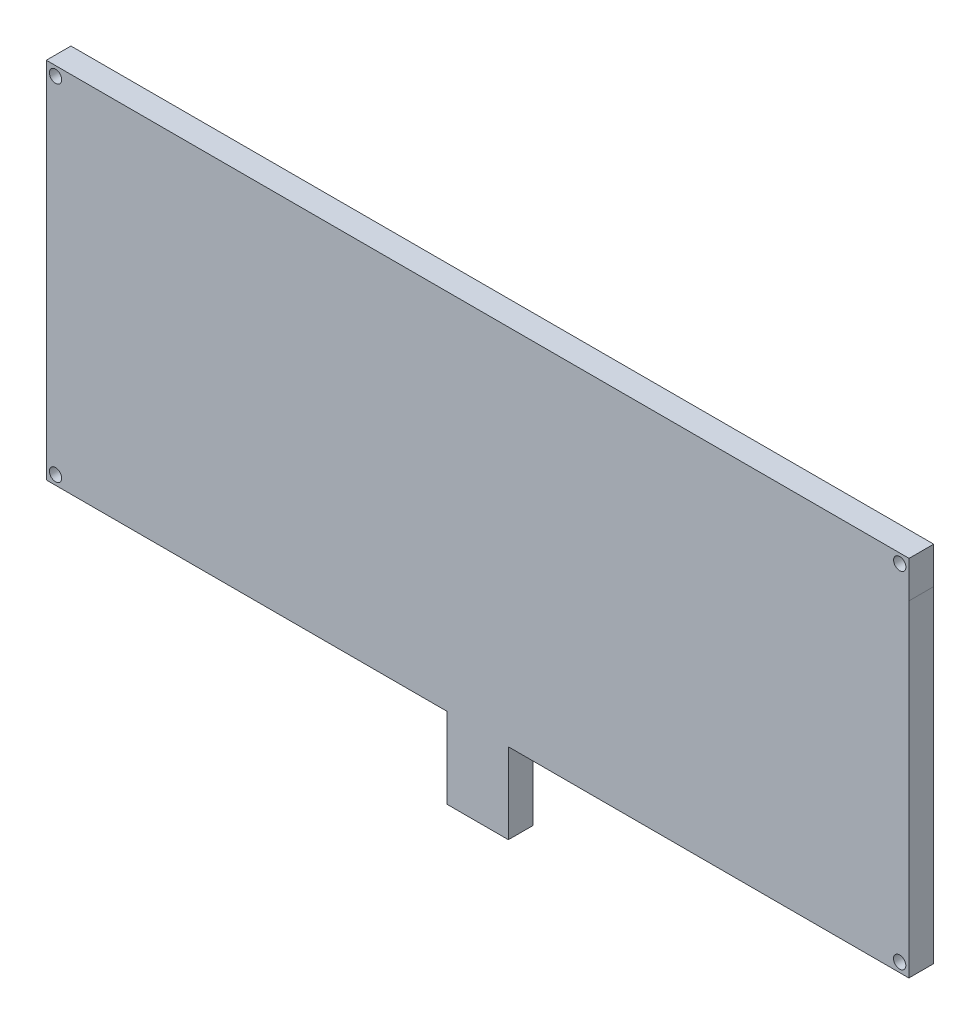
ISO-10303-21;
HEADER;
FILE_DESCRIPTION(('STEP AP214'),'2;1');
FILE_NAME('part.step','',(''),(''),'','','');
FILE_SCHEMA(('AUTOMOTIVE_DESIGN { 1 0 10303 214 1 1 1 1 }'));
ENDSEC;
DATA;
#1=APPLICATION_CONTEXT('core data for automotive mechanical design processes');
#2=APPLICATION_PROTOCOL_DEFINITION('international standard','automotive_design',2000,#1);
#3=PRODUCT_CONTEXT('',#1,'mechanical');
#4=PRODUCT('Part','Part','',(#3));
#5=PRODUCT_RELATED_PRODUCT_CATEGORY('part','',(#4));
#6=PRODUCT_DEFINITION_FORMATION('','',#4);
#7=PRODUCT_DEFINITION_CONTEXT('part definition',#1,'design');
#8=PRODUCT_DEFINITION('design','',#6,#7);
#9=PRODUCT_DEFINITION_SHAPE('','',#8);
#10=(LENGTH_UNIT() NAMED_UNIT(*) SI_UNIT(.MILLI.,.METRE.));
#11=(NAMED_UNIT(*) PLANE_ANGLE_UNIT() SI_UNIT($,.RADIAN.));
#12=(NAMED_UNIT(*) SI_UNIT($,.STERADIAN.) SOLID_ANGLE_UNIT());
#13=UNCERTAINTY_MEASURE_WITH_UNIT(LENGTH_MEASURE(1.E-05),#10,'distance_accuracy_value','');
#14=(GEOMETRIC_REPRESENTATION_CONTEXT(3) GLOBAL_UNCERTAINTY_ASSIGNED_CONTEXT((#13)) GLOBAL_UNIT_ASSIGNED_CONTEXT((#10,
#11,#12)) REPRESENTATION_CONTEXT('',''));
#15=CARTESIAN_POINT('',(0.,0.,0.));
#16=DIRECTION('',(0.,0.,1.));
#17=DIRECTION('',(1.,0.,0.));
#18=AXIS2_PLACEMENT_3D('',#15,#16,#17);
#19=CARTESIAN_POINT('',(-4.99956384997567,-26.5660402151457,4.));
#20=DIRECTION('',(1.,0.,0.));
#21=DIRECTION('',(0.,1.,0.));
#22=AXIS2_PLACEMENT_3D('',#19,#20,#21);
#23=PLANE('',#22);
#24=DIRECTION('',(0.,-1.,0.));
#25=VECTOR('',#24,1.);
#26=CARTESIAN_POINT('',(-4.99956384997567,-26.5660402151457,0.));
#27=LINE('',#26,#25);
#28=CARTESIAN_POINT('',(-4.99956384997567,-26.5,0.));
#29=VERTEX_POINT('',#28);
#30=CARTESIAN_POINT('',(-4.99956384997566,-39.5660402151457,0.));
#31=VERTEX_POINT('',#30);
#32=EDGE_CURVE('E93',#29,#31,#27,.T.);
#33=ORIENTED_EDGE('',*,*,#32,.T.);
#34=DIRECTION('',(0.,0.,-1.));
#35=VECTOR('',#34,1.);
#36=CARTESIAN_POINT('',(-4.99956384997566,-39.5660402151457,4.));
#37=LINE('',#36,#35);
#38=CARTESIAN_POINT('',(-4.99956384997566,-39.5660402151457,4.));
#39=VERTEX_POINT('',#38);
#40=EDGE_CURVE('E71',#39,#31,#37,.T.);
#41=ORIENTED_EDGE('',*,*,#40,.F.);
#42=DIRECTION('',(0.,-1.,0.));
#43=VECTOR('',#42,1.);
#44=CARTESIAN_POINT('',(-4.99956384997567,-26.5660402151457,4.));
#45=LINE('',#44,#43);
#46=CARTESIAN_POINT('',(-4.99956384997567,-26.5,4.));
#47=VERTEX_POINT('',#46);
#48=EDGE_CURVE('E105',#47,#39,#45,.T.);
#49=ORIENTED_EDGE('',*,*,#48,.F.);
#50=DIRECTION('',(0.,0.,-1.));
#51=VECTOR('',#50,1.);
#52=CARTESIAN_POINT('',(-4.99956384997567,-26.5,4.));
#53=LINE('',#52,#51);
#54=EDGE_CURVE('E12',#47,#29,#53,.T.);
#55=ORIENTED_EDGE('',*,*,#54,.T.);
#56=EDGE_LOOP('',(#33,#41,#49,#55));
#57=FACE_BOUND('',#56,.T.);
#58=ADVANCED_FACE('F61',(#57),#23,.F.);
#59=CARTESIAN_POINT('',(5.,-39.5660402151457,4.));
#60=DIRECTION('',(0.,1.,0.));
#61=DIRECTION('',(0.,0.,1.));
#62=AXIS2_PLACEMENT_3D('',#59,#60,#61);
#63=PLANE('',#62);
#64=DIRECTION('',(1.,0.,0.));
#65=VECTOR('',#64,1.);
#66=CARTESIAN_POINT('',(5.,-39.5660402151457,0.));
#67=LINE('',#66,#65);
#68=CARTESIAN_POINT('',(5.,-39.5660402151457,0.));
#69=VERTEX_POINT('',#68);
#70=EDGE_CURVE('E100',#31,#69,#67,.T.);
#71=ORIENTED_EDGE('',*,*,#70,.T.);
#72=DIRECTION('',(0.,0.,-1.));
#73=VECTOR('',#72,1.);
#74=CARTESIAN_POINT('',(5.,-39.5660402151457,4.));
#75=LINE('',#74,#73);
#76=CARTESIAN_POINT('',(5.,-39.5660402151457,4.));
#77=VERTEX_POINT('',#76);
#78=EDGE_CURVE('E228',#77,#69,#75,.T.);
#79=ORIENTED_EDGE('',*,*,#78,.F.);
#80=DIRECTION('',(1.,0.,0.));
#81=VECTOR('',#80,1.);
#82=CARTESIAN_POINT('',(5.,-39.5660402151457,4.));
#83=LINE('',#82,#81);
#84=EDGE_CURVE('E212',#39,#77,#83,.T.);
#85=ORIENTED_EDGE('',*,*,#84,.F.);
#86=ORIENTED_EDGE('',*,*,#40,.T.);
#87=EDGE_LOOP('',(#71,#79,#85,#86));
#88=FACE_BOUND('',#87,.T.);
#89=ADVANCED_FACE('F283',(#88),#63,.F.);
#90=CARTESIAN_POINT('',(5.,-26.5,4.));
#91=DIRECTION('',(-1.,0.,0.));
#92=DIRECTION('',(0.,-1.,0.));
#93=AXIS2_PLACEMENT_3D('',#90,#91,#92);
#94=PLANE('',#93);
#95=DIRECTION('',(0.,1.,0.));
#96=VECTOR('',#95,1.);
#97=CARTESIAN_POINT('',(5.,-26.5,0.));
#98=LINE('',#97,#96);
#99=CARTESIAN_POINT('',(5.,-26.5,0.));
#100=VERTEX_POINT('',#99);
#101=EDGE_CURVE('E213',#69,#100,#98,.T.);
#102=ORIENTED_EDGE('',*,*,#101,.T.);
#103=DIRECTION('',(0.,0.,-1.));
#104=VECTOR('',#103,1.);
#105=CARTESIAN_POINT('',(5.,-26.5,4.));
#106=LINE('',#105,#104);
#107=CARTESIAN_POINT('',(5.,-26.5,4.));
#108=VERTEX_POINT('',#107);
#109=EDGE_CURVE('E218',#108,#100,#106,.T.);
#110=ORIENTED_EDGE('',*,*,#109,.F.);
#111=DIRECTION('',(0.,1.,0.));
#112=VECTOR('',#111,1.);
#113=CARTESIAN_POINT('',(5.,-26.5,4.));
#114=LINE('',#113,#112);
#115=EDGE_CURVE('E80',#77,#108,#114,.T.);
#116=ORIENTED_EDGE('',*,*,#115,.F.);
#117=ORIENTED_EDGE('',*,*,#78,.T.);
#118=EDGE_LOOP('',(#102,#110,#116,#117));
#119=FACE_BOUND('',#118,.T.);
#120=ADVANCED_FACE('F281',(#119),#94,.F.);
#121=CARTESIAN_POINT('',(0.,0.,4.));
#122=DIRECTION('',(0.,0.,-1.));
#123=DIRECTION('',(-1.,0.,0.));
#124=AXIS2_PLACEMENT_3D('',#121,#122,#123);
#125=PLANE('',#124);
#126=CARTESIAN_POINT('',(-68.4961847591732,-25.,4.));
#127=DIRECTION('',(0.,0.,1.));
#128=DIRECTION('',(1.,0.,0.));
#129=AXIS2_PLACEMENT_3D('',#126,#127,#128);
#130=CIRCLE('',#129,0.999999999999998);
#131=CARTESIAN_POINT('',(-67.4961847591732,-25.,4.));
#132=VERTEX_POINT('',#131);
#133=EDGE_CURVE('E241',#132,#132,#130,.T.);
#134=ORIENTED_EDGE('',*,*,#133,.F.);
#135=EDGE_LOOP('',(#134));
#136=FACE_BOUND('',#135,.T.);
#137=CARTESIAN_POINT('',(68.5038152408268,-25.,4.));
#138=DIRECTION('',(0.,0.,1.));
#139=DIRECTION('',(1.,0.,0.));
#140=AXIS2_PLACEMENT_3D('',#137,#138,#139);
#141=CIRCLE('',#140,0.999999999999998);
#142=CARTESIAN_POINT('',(69.5038152408268,-25.,4.));
#143=VERTEX_POINT('',#142);
#144=EDGE_CURVE('E456',#143,#143,#141,.T.);
#145=ORIENTED_EDGE('',*,*,#144,.F.);
#146=EDGE_LOOP('',(#145));
#147=FACE_BOUND('',#146,.T.);
#148=CARTESIAN_POINT('',(68.5188581291216,31.,4.));
#149=DIRECTION('',(0.,0.,1.));
#150=DIRECTION('',(1.,0.,0.));
#151=AXIS2_PLACEMENT_3D('',#148,#149,#150);
#152=CIRCLE('',#151,0.999999999999997);
#153=CARTESIAN_POINT('',(69.5188581291216,31.,4.));
#154=VERTEX_POINT('',#153);
#155=EDGE_CURVE('E459',#154,#154,#152,.T.);
#156=ORIENTED_EDGE('',*,*,#155,.F.);
#157=EDGE_LOOP('',(#156));
#158=FACE_BOUND('',#157,.T.);
#159=CARTESIAN_POINT('',(-68.4961847591732,31.,4.));
#160=DIRECTION('',(0.,0.,-1.));
#161=DIRECTION('',(-1.,0.,0.));
#162=AXIS2_PLACEMENT_3D('',#159,#160,#161);
#163=CIRCLE('',#162,0.999999999999997);
#164=CARTESIAN_POINT('',(-69.4961847591732,31.,4.));
#165=VERTEX_POINT('',#164);
#166=EDGE_CURVE('E176',#165,#165,#163,.T.);
#167=ORIENTED_EDGE('',*,*,#166,.T.);
#168=EDGE_LOOP('',(#167));
#169=FACE_BOUND('',#168,.T.);
#170=ORIENTED_EDGE('',*,*,#115,.T.);
#171=DIRECTION('',(1.,0.,0.));
#172=VECTOR('',#171,1.);
#173=CARTESIAN_POINT('',(-70.,-26.5,4.));
#174=LINE('',#173,#172);
#175=CARTESIAN_POINT('',(70.,-26.5,4.));
#176=VERTEX_POINT('',#175);
#177=EDGE_CURVE('E185',#108,#176,#174,.T.);
#178=ORIENTED_EDGE('',*,*,#177,.T.);
#179=DIRECTION('',(0.,1.,0.));
#180=VECTOR('',#179,1.);
#181=CARTESIAN_POINT('',(70.,-26.5,4.));
#182=LINE('',#181,#180);
#183=CARTESIAN_POINT('',(70.,26.5,4.));
#184=VERTEX_POINT('',#183);
#185=EDGE_CURVE('E147',#176,#184,#182,.T.);
#186=ORIENTED_EDGE('',*,*,#185,.T.);
#187=DIRECTION('',(0.00501423306183546,0.999987428654381,0.));
#188=VECTOR('',#187,1.);
#189=CARTESIAN_POINT('',(70.0300857765897,32.5,4.));
#190=LINE('',#189,#188);
#191=CARTESIAN_POINT('',(70.0300857765897,32.5,4.));
#192=VERTEX_POINT('',#191);
#193=EDGE_CURVE('E140',#184,#192,#190,.T.);
#194=ORIENTED_EDGE('',*,*,#193,.T.);
#195=DIRECTION('',(-1.,0.,0.));
#196=VECTOR('',#195,1.);
#197=CARTESIAN_POINT('',(-70.,32.5,4.));
#198=LINE('',#197,#196);
#199=CARTESIAN_POINT('',(-70.,32.5,4.));
#200=VERTEX_POINT('',#199);
#201=EDGE_CURVE('E144',#192,#200,#198,.T.);
#202=ORIENTED_EDGE('',*,*,#201,.T.);
#203=DIRECTION('',(0.,-1.,0.));
#204=VECTOR('',#203,1.);
#205=CARTESIAN_POINT('',(-70.,-26.5,4.));
#206=LINE('',#205,#204);
#207=CARTESIAN_POINT('',(-70.,-26.5,4.));
#208=VERTEX_POINT('',#207);
#209=EDGE_CURVE('E181',#200,#208,#206,.T.);
#210=ORIENTED_EDGE('',*,*,#209,.T.);
#211=EDGE_CURVE('E186',#208,#47,#174,.T.);
#212=ORIENTED_EDGE('',*,*,#211,.T.);
#213=ORIENTED_EDGE('',*,*,#48,.T.);
#214=ORIENTED_EDGE('',*,*,#84,.T.);
#215=EDGE_LOOP('',(#170,#178,#186,#194,#202,#210,#212,#213,#214));
#216=FACE_BOUND('',#215,.T.);
#217=ADVANCED_FACE('F142',(#136,#147,#158,#169,#216),#125,.F.);
#218=CARTESIAN_POINT('',(0.,0.,0.));
#219=DIRECTION('',(0.,0.,-1.));
#220=DIRECTION('',(-1.,0.,0.));
#221=AXIS2_PLACEMENT_3D('',#218,#219,#220);
#222=PLANE('',#221);
#223=CARTESIAN_POINT('',(-68.4961847591732,-25.,0.));
#224=DIRECTION('',(0.,0.,-1.));
#225=DIRECTION('',(-1.,0.,0.));
#226=AXIS2_PLACEMENT_3D('',#223,#224,#225);
#227=CIRCLE('',#226,0.999999999999998);
#228=CARTESIAN_POINT('',(-67.4961847591732,-25.,0.));
#229=VERTEX_POINT('',#228);
#230=EDGE_CURVE('E64',#229,#229,#227,.T.);
#231=ORIENTED_EDGE('',*,*,#230,.F.);
#232=EDGE_LOOP('',(#231));
#233=FACE_BOUND('',#232,.T.);
#234=CARTESIAN_POINT('',(68.5038152408268,-25.,0.));
#235=DIRECTION('',(0.,0.,-1.));
#236=DIRECTION('',(-1.,0.,0.));
#237=AXIS2_PLACEMENT_3D('',#234,#235,#236);
#238=CIRCLE('',#237,0.999999999999998);
#239=CARTESIAN_POINT('',(69.5038152408268,-25.,0.));
#240=VERTEX_POINT('',#239);
#241=EDGE_CURVE('E240',#240,#240,#238,.T.);
#242=ORIENTED_EDGE('',*,*,#241,.F.);
#243=EDGE_LOOP('',(#242));
#244=FACE_BOUND('',#243,.T.);
#245=CARTESIAN_POINT('',(68.5188581291216,31.,0.));
#246=DIRECTION('',(0.,0.,-1.));
#247=DIRECTION('',(-1.,0.,0.));
#248=AXIS2_PLACEMENT_3D('',#245,#246,#247);
#249=CIRCLE('',#248,0.999999999999997);
#250=CARTESIAN_POINT('',(69.5188581291216,31.,0.));
#251=VERTEX_POINT('',#250);
#252=EDGE_CURVE('E237',#251,#251,#249,.T.);
#253=ORIENTED_EDGE('',*,*,#252,.F.);
#254=EDGE_LOOP('',(#253));
#255=FACE_BOUND('',#254,.T.);
#256=CARTESIAN_POINT('',(-68.4961847591732,31.,0.));
#257=DIRECTION('',(0.,0.,-1.));
#258=DIRECTION('',(-1.,0.,0.));
#259=AXIS2_PLACEMENT_3D('',#256,#257,#258);
#260=CIRCLE('',#259,0.999999999999997);
#261=CARTESIAN_POINT('',(-69.4961847591732,31.,0.));
#262=VERTEX_POINT('',#261);
#263=EDGE_CURVE('E233',#262,#262,#260,.T.);
#264=ORIENTED_EDGE('',*,*,#263,.F.);
#265=EDGE_LOOP('',(#264));
#266=FACE_BOUND('',#265,.T.);
#267=ORIENTED_EDGE('',*,*,#32,.F.);
#268=DIRECTION('',(1.,0.,0.));
#269=VECTOR('',#268,1.);
#270=CARTESIAN_POINT('',(-70.,-26.5,0.));
#271=LINE('',#270,#269);
#272=CARTESIAN_POINT('',(-70.,-26.5,0.));
#273=VERTEX_POINT('',#272);
#274=EDGE_CURVE('E182',#273,#29,#271,.T.);
#275=ORIENTED_EDGE('',*,*,#274,.F.);
#276=DIRECTION('',(0.,-1.,0.));
#277=VECTOR('',#276,1.);
#278=CARTESIAN_POINT('',(-70.,-26.5,0.));
#279=LINE('',#278,#277);
#280=CARTESIAN_POINT('',(-70.,32.5,0.));
#281=VERTEX_POINT('',#280);
#282=EDGE_CURVE('E193',#281,#273,#279,.T.);
#283=ORIENTED_EDGE('',*,*,#282,.F.);
#284=DIRECTION('',(-1.,0.,0.));
#285=VECTOR('',#284,1.);
#286=CARTESIAN_POINT('',(-70.,32.5,0.));
#287=LINE('',#286,#285);
#288=CARTESIAN_POINT('',(70.0300857765897,32.5,0.));
#289=VERTEX_POINT('',#288);
#290=EDGE_CURVE('E152',#289,#281,#287,.T.);
#291=ORIENTED_EDGE('',*,*,#290,.F.);
#292=DIRECTION('',(0.00501423306183546,0.999987428654381,0.));
#293=VECTOR('',#292,1.);
#294=CARTESIAN_POINT('',(70.0300857765897,32.5,0.));
#295=LINE('',#294,#293);
#296=CARTESIAN_POINT('',(70.,26.5,0.));
#297=VERTEX_POINT('',#296);
#298=EDGE_CURVE('E158',#297,#289,#295,.T.);
#299=ORIENTED_EDGE('',*,*,#298,.F.);
#300=DIRECTION('',(0.,1.,0.));
#301=VECTOR('',#300,1.);
#302=CARTESIAN_POINT('',(70.,-26.5,0.));
#303=LINE('',#302,#301);
#304=CARTESIAN_POINT('',(70.,-26.5,0.));
#305=VERTEX_POINT('',#304);
#306=EDGE_CURVE('E163',#305,#297,#303,.T.);
#307=ORIENTED_EDGE('',*,*,#306,.F.);
#308=EDGE_CURVE('E196',#100,#305,#271,.T.);
#309=ORIENTED_EDGE('',*,*,#308,.F.);
#310=ORIENTED_EDGE('',*,*,#101,.F.);
#311=ORIENTED_EDGE('',*,*,#70,.F.);
#312=EDGE_LOOP('',(#267,#275,#283,#291,#299,#307,#309,#310,#311));
#313=FACE_BOUND('',#312,.T.);
#314=ADVANCED_FACE('F253',(#233,#244,#255,#266,#313),#222,.T.);
#315=CARTESIAN_POINT('',(-70.,-26.5,4.));
#316=DIRECTION('',(0.,1.,0.));
#317=DIRECTION('',(0.,0.,1.));
#318=AXIS2_PLACEMENT_3D('',#315,#316,#317);
#319=PLANE('',#318);
#320=ORIENTED_EDGE('',*,*,#177,.F.);
#321=ORIENTED_EDGE('',*,*,#109,.T.);
#322=ORIENTED_EDGE('',*,*,#308,.T.);
#323=DIRECTION('',(0.,0.,-1.));
#324=VECTOR('',#323,1.);
#325=CARTESIAN_POINT('',(70.,-26.5,4.));
#326=LINE('',#325,#324);
#327=EDGE_CURVE('E190',#176,#305,#326,.T.);
#328=ORIENTED_EDGE('',*,*,#327,.F.);
#329=EDGE_LOOP('',(#320,#321,#322,#328));
#330=FACE_BOUND('',#329,.T.);
#331=ADVANCED_FACE('F256',(#330),#319,.F.);
#332=CARTESIAN_POINT('',(70.,-26.5,4.));
#333=DIRECTION('',(-1.,0.,0.));
#334=DIRECTION('',(0.,0.,1.));
#335=AXIS2_PLACEMENT_3D('',#332,#333,#334);
#336=PLANE('',#335);
#337=ORIENTED_EDGE('',*,*,#306,.T.);
#338=DIRECTION('',(0.,0.,-1.));
#339=VECTOR('',#338,1.);
#340=CARTESIAN_POINT('',(70.,26.5,4.));
#341=LINE('',#340,#339);
#342=EDGE_CURVE('E207',#184,#297,#341,.T.);
#343=ORIENTED_EDGE('',*,*,#342,.F.);
#344=ORIENTED_EDGE('',*,*,#185,.F.);
#345=ORIENTED_EDGE('',*,*,#327,.T.);
#346=EDGE_LOOP('',(#337,#343,#344,#345));
#347=FACE_BOUND('',#346,.T.);
#348=ADVANCED_FACE('F274',(#347),#336,.F.);
#349=CARTESIAN_POINT('',(-70.,-26.5,4.));
#350=DIRECTION('',(1.,0.,0.));
#351=DIRECTION('',(0.,0.,-1.));
#352=AXIS2_PLACEMENT_3D('',#349,#350,#351);
#353=PLANE('',#352);
#354=ORIENTED_EDGE('',*,*,#282,.T.);
#355=DIRECTION('',(0.,0.,-1.));
#356=VECTOR('',#355,1.);
#357=CARTESIAN_POINT('',(-70.,-26.5,4.));
#358=LINE('',#357,#356);
#359=EDGE_CURVE('E203',#208,#273,#358,.T.);
#360=ORIENTED_EDGE('',*,*,#359,.F.);
#361=ORIENTED_EDGE('',*,*,#209,.F.);
#362=DIRECTION('',(0.,0.,-1.));
#363=VECTOR('',#362,1.);
#364=CARTESIAN_POINT('',(-70.,32.5,4.));
#365=LINE('',#364,#363);
#366=EDGE_CURVE('E164',#200,#281,#365,.T.);
#367=ORIENTED_EDGE('',*,*,#366,.T.);
#368=EDGE_LOOP('',(#354,#360,#361,#367));
#369=FACE_BOUND('',#368,.T.);
#370=ADVANCED_FACE('F270',(#369),#353,.F.);
#371=ORIENTED_EDGE('',*,*,#54,.F.);
#372=ORIENTED_EDGE('',*,*,#211,.F.);
#373=ORIENTED_EDGE('',*,*,#359,.T.);
#374=ORIENTED_EDGE('',*,*,#274,.T.);
#375=EDGE_LOOP('',(#371,#372,#373,#374));
#376=FACE_BOUND('',#375,.T.);
#377=ADVANCED_FACE('F267',(#376),#319,.F.);
#378=CARTESIAN_POINT('',(70.0300857765897,32.5,4.));
#379=DIRECTION('',(-0.999987428654381,0.00501423306183546,0.));
#380=DIRECTION('',(-0.00501423306183546,-0.999987428654382,0.));
#381=AXIS2_PLACEMENT_3D('',#378,#379,#380);
#382=PLANE('',#381);
#383=ORIENTED_EDGE('',*,*,#298,.T.);
#384=DIRECTION('',(0.,0.,-1.));
#385=VECTOR('',#384,1.);
#386=CARTESIAN_POINT('',(70.0300857765897,32.5,4.));
#387=LINE('',#386,#385);
#388=EDGE_CURVE('E155',#192,#289,#387,.T.);
#389=ORIENTED_EDGE('',*,*,#388,.F.);
#390=ORIENTED_EDGE('',*,*,#193,.F.);
#391=ORIENTED_EDGE('',*,*,#342,.T.);
#392=EDGE_LOOP('',(#383,#389,#390,#391));
#393=FACE_BOUND('',#392,.T.);
#394=ADVANCED_FACE('F156',(#393),#382,.F.);
#395=CARTESIAN_POINT('',(-70.,32.5,4.));
#396=DIRECTION('',(0.,-1.,0.));
#397=DIRECTION('',(0.,0.,-1.));
#398=AXIS2_PLACEMENT_3D('',#395,#396,#397);
#399=PLANE('',#398);
#400=ORIENTED_EDGE('',*,*,#290,.T.);
#401=ORIENTED_EDGE('',*,*,#366,.F.);
#402=ORIENTED_EDGE('',*,*,#201,.F.);
#403=ORIENTED_EDGE('',*,*,#388,.T.);
#404=EDGE_LOOP('',(#400,#401,#402,#403));
#405=FACE_BOUND('',#404,.T.);
#406=ADVANCED_FACE('F166',(#405),#399,.F.);
#407=CARTESIAN_POINT('',(-68.4961847591732,31.,-2.));
#408=DIRECTION('',(0.,0.,1.));
#409=DIRECTION('',(1.,0.,0.));
#410=AXIS2_PLACEMENT_3D('',#407,#408,#409);
#411=CYLINDRICAL_SURFACE('',#410,0.999999999999997);
#412=ORIENTED_EDGE('',*,*,#263,.T.);
#413=EDGE_LOOP('',(#412));
#414=FACE_BOUND('',#413,.T.);
#415=ORIENTED_EDGE('',*,*,#166,.F.);
#416=EDGE_LOOP('',(#415));
#417=FACE_BOUND('',#416,.T.);
#418=ADVANCED_FACE('F304',(#414,#417),#411,.F.);
#419=CARTESIAN_POINT('',(68.5188581291216,31.,-1.2E-05));
#420=DIRECTION('',(0.,0.,1.));
#421=DIRECTION('',(1.,0.,0.));
#422=AXIS2_PLACEMENT_3D('',#419,#420,#421);
#423=CYLINDRICAL_SURFACE('',#422,0.999999999999997);
#424=CARTESIAN_POINT('',(69.5188581291216,31.,0.));
#425=CARTESIAN_POINT('',(69.5188581291216,31.,0.0416666666666667));
#426=CARTESIAN_POINT('',(69.5188581291216,31.,0.0833333333333333));
#427=CARTESIAN_POINT('',(69.5188581291216,31.,0.166666666666667));
#428=CARTESIAN_POINT('',(69.5188581291216,31.,0.208333333333333));
#429=CARTESIAN_POINT('',(69.5188581291216,31.,0.291666666666667));
#430=CARTESIAN_POINT('',(69.5188581291216,31.,0.333333333333333));
#431=CARTESIAN_POINT('',(69.5188581291216,31.,0.416666666666667));
#432=CARTESIAN_POINT('',(69.5188581291216,31.,0.458333333333333));
#433=CARTESIAN_POINT('',(69.5188581291216,31.,0.541666666666667));
#434=CARTESIAN_POINT('',(69.5188581291216,31.,0.583333333333333));
#435=CARTESIAN_POINT('',(69.5188581291216,31.,0.666666666666667));
#436=CARTESIAN_POINT('',(69.5188581291216,31.,0.708333333333333));
#437=CARTESIAN_POINT('',(69.5188581291216,31.,0.791666666666667));
#438=CARTESIAN_POINT('',(69.5188581291216,31.,0.833333333333333));
#439=CARTESIAN_POINT('',(69.5188581291216,31.,0.916666666666667));
#440=CARTESIAN_POINT('',(69.5188581291216,31.,0.958333333333333));
#441=CARTESIAN_POINT('',(69.5188581291216,31.,1.04166666666667));
#442=CARTESIAN_POINT('',(69.5188581291216,31.,1.08333333333333));
#443=CARTESIAN_POINT('',(69.5188581291216,31.,1.16666666666667));
#444=CARTESIAN_POINT('',(69.5188581291216,31.,1.20833333333333));
#445=CARTESIAN_POINT('',(69.5188581291216,31.,1.29166666666667));
#446=CARTESIAN_POINT('',(69.5188581291216,31.,1.33333333333333));
#447=CARTESIAN_POINT('',(69.5188581291216,31.,1.41666666666667));
#448=CARTESIAN_POINT('',(69.5188581291216,31.,1.45833333333333));
#449=CARTESIAN_POINT('',(69.5188581291216,31.,1.54166666666667));
#450=CARTESIAN_POINT('',(69.5188581291216,31.,1.58333333333333));
#451=CARTESIAN_POINT('',(69.5188581291216,31.,1.66666666666667));
#452=CARTESIAN_POINT('',(69.5188581291216,31.,1.70833333333333));
#453=CARTESIAN_POINT('',(69.5188581291216,31.,1.79166666666667));
#454=CARTESIAN_POINT('',(69.5188581291216,31.,1.83333333333333));
#455=CARTESIAN_POINT('',(69.5188581291216,31.,1.91666666666667));
#456=CARTESIAN_POINT('',(69.5188581291216,31.,1.95833333333333));
#457=CARTESIAN_POINT('',(69.5188581291216,31.,2.04166666666667));
#458=CARTESIAN_POINT('',(69.5188581291216,31.,2.08333333333333));
#459=CARTESIAN_POINT('',(69.5188581291216,31.,2.16666666666667));
#460=CARTESIAN_POINT('',(69.5188581291216,31.,2.20833333333333));
#461=CARTESIAN_POINT('',(69.5188581291216,31.,2.29166666666667));
#462=CARTESIAN_POINT('',(69.5188581291216,31.,2.33333333333333));
#463=CARTESIAN_POINT('',(69.5188581291216,31.,2.41666666666667));
#464=CARTESIAN_POINT('',(69.5188581291216,31.,2.45833333333333));
#465=CARTESIAN_POINT('',(69.5188581291216,31.,2.54166666666667));
#466=CARTESIAN_POINT('',(69.5188581291216,31.,2.58333333333333));
#467=CARTESIAN_POINT('',(69.5188581291216,31.,2.66666666666667));
#468=CARTESIAN_POINT('',(69.5188581291216,31.,2.70833333333333));
#469=CARTESIAN_POINT('',(69.5188581291216,31.,2.79166666666667));
#470=CARTESIAN_POINT('',(69.5188581291216,31.,2.83333333333333));
#471=CARTESIAN_POINT('',(69.5188581291216,31.,2.91666666666667));
#472=CARTESIAN_POINT('',(69.5188581291216,31.,2.95833333333333));
#473=CARTESIAN_POINT('',(69.5188581291216,31.,3.04166666666667));
#474=CARTESIAN_POINT('',(69.5188581291216,31.,3.08333333333333));
#475=CARTESIAN_POINT('',(69.5188581291216,31.,3.16666666666667));
#476=CARTESIAN_POINT('',(69.5188581291216,31.,3.20833333333333));
#477=CARTESIAN_POINT('',(69.5188581291216,31.,3.29166666666667));
#478=CARTESIAN_POINT('',(69.5188581291216,31.,3.33333333333333));
#479=CARTESIAN_POINT('',(69.5188581291216,31.,3.41666666666667));
#480=CARTESIAN_POINT('',(69.5188581291216,31.,3.45833333333333));
#481=CARTESIAN_POINT('',(69.5188581291216,31.,3.54166666666667));
#482=CARTESIAN_POINT('',(69.5188581291216,31.,3.58333333333333));
#483=CARTESIAN_POINT('',(69.5188581291216,31.,3.66666666666667));
#484=CARTESIAN_POINT('',(69.5188581291216,31.,3.70833333333333));
#485=CARTESIAN_POINT('',(69.5188581291216,31.,3.79166666666667));
#486=CARTESIAN_POINT('',(69.5188581291216,31.,3.83333333333333));
#487=CARTESIAN_POINT('',(69.5188581291216,31.,3.91666666666667));
#488=CARTESIAN_POINT('',(69.5188581291216,31.,3.95833333333333));
#489=CARTESIAN_POINT('',(69.5188581291216,31.,4.));
#490=B_SPLINE_CURVE_WITH_KNOTS('',3,(#424,#425,#426,#427,#428,#429,#430,#431,#432,#433,#434,
#435,#436,#437,#438,#439,#440,#441,#442,#443,#444,#445,#446,#447,#448,#449,#450,#451,#452,#453,
#454,#455,#456,#457,#458,#459,#460,#461,#462,#463,#464,#465,#466,#467,#468,#469,#470,#471,#472,
#473,#474,#475,#476,#477,#478,#479,#480,#481,#482,#483,#484,#485,#486,#487,#488,#489),
.UNSPECIFIED.,.F.,.F.,(4,2,2,2,2,2,2,2,2,2,2,2,2,2,2,2,2,2,2,2,2,2,2,2,2,2,2,2,2,2,2,2,4),(0.,
0.125,0.25,0.375,0.5,0.625,0.75,0.875,1.,1.125,1.25,1.375,1.5,1.625,1.75,1.875,2.,2.125,2.25,
2.375,2.5,2.625,2.75,2.875,3.,3.125,3.25,3.375,3.5,3.625,3.75,3.875,4.),.UNSPECIFIED.);
#491=EDGE_CURVE('BSEAM307',#251,#154,#490,.T.);
#492=ORIENTED_EDGE('',*,*,#252,.T.);
#493=ORIENTED_EDGE('',*,*,#155,.T.);
#494=ORIENTED_EDGE('',*,*,#491,.T.);
#495=ORIENTED_EDGE('',*,*,#491,.F.);
#496=EDGE_LOOP('',(#492,#494,#493,#495));
#497=FACE_BOUND('',#496,.T.);
#498=ADVANCED_FACE('F307',(#497),#423,.F.);
#499=CARTESIAN_POINT('',(68.5038152408268,-25.,-1.2E-05));
#500=DIRECTION('',(0.,0.,1.));
#501=DIRECTION('',(1.,0.,0.));
#502=AXIS2_PLACEMENT_3D('',#499,#500,#501);
#503=CYLINDRICAL_SURFACE('',#502,0.999999999999998);
#504=CARTESIAN_POINT('',(69.5038152408268,-25.,0.));
#505=CARTESIAN_POINT('',(69.5038152408268,-25.,0.0416666666666667));
#506=CARTESIAN_POINT('',(69.5038152408268,-25.,0.0833333333333333));
#507=CARTESIAN_POINT('',(69.5038152408268,-25.,0.166666666666667));
#508=CARTESIAN_POINT('',(69.5038152408268,-25.,0.208333333333333));
#509=CARTESIAN_POINT('',(69.5038152408268,-25.,0.291666666666667));
#510=CARTESIAN_POINT('',(69.5038152408268,-25.,0.333333333333333));
#511=CARTESIAN_POINT('',(69.5038152408268,-25.,0.416666666666667));
#512=CARTESIAN_POINT('',(69.5038152408268,-25.,0.458333333333333));
#513=CARTESIAN_POINT('',(69.5038152408268,-25.,0.541666666666667));
#514=CARTESIAN_POINT('',(69.5038152408268,-25.,0.583333333333333));
#515=CARTESIAN_POINT('',(69.5038152408268,-25.,0.666666666666667));
#516=CARTESIAN_POINT('',(69.5038152408268,-25.,0.708333333333333));
#517=CARTESIAN_POINT('',(69.5038152408268,-25.,0.791666666666667));
#518=CARTESIAN_POINT('',(69.5038152408268,-25.,0.833333333333333));
#519=CARTESIAN_POINT('',(69.5038152408268,-25.,0.916666666666667));
#520=CARTESIAN_POINT('',(69.5038152408268,-25.,0.958333333333333));
#521=CARTESIAN_POINT('',(69.5038152408268,-25.,1.04166666666667));
#522=CARTESIAN_POINT('',(69.5038152408268,-25.,1.08333333333333));
#523=CARTESIAN_POINT('',(69.5038152408268,-25.,1.16666666666667));
#524=CARTESIAN_POINT('',(69.5038152408268,-25.,1.20833333333333));
#525=CARTESIAN_POINT('',(69.5038152408268,-25.,1.29166666666667));
#526=CARTESIAN_POINT('',(69.5038152408268,-25.,1.33333333333333));
#527=CARTESIAN_POINT('',(69.5038152408268,-25.,1.41666666666667));
#528=CARTESIAN_POINT('',(69.5038152408268,-25.,1.45833333333333));
#529=CARTESIAN_POINT('',(69.5038152408268,-25.,1.54166666666667));
#530=CARTESIAN_POINT('',(69.5038152408268,-25.,1.58333333333333));
#531=CARTESIAN_POINT('',(69.5038152408268,-25.,1.66666666666667));
#532=CARTESIAN_POINT('',(69.5038152408268,-25.,1.70833333333333));
#533=CARTESIAN_POINT('',(69.5038152408268,-25.,1.79166666666667));
#534=CARTESIAN_POINT('',(69.5038152408268,-25.,1.83333333333333));
#535=CARTESIAN_POINT('',(69.5038152408268,-25.,1.91666666666667));
#536=CARTESIAN_POINT('',(69.5038152408268,-25.,1.95833333333333));
#537=CARTESIAN_POINT('',(69.5038152408268,-25.,2.04166666666667));
#538=CARTESIAN_POINT('',(69.5038152408268,-25.,2.08333333333333));
#539=CARTESIAN_POINT('',(69.5038152408268,-25.,2.16666666666667));
#540=CARTESIAN_POINT('',(69.5038152408268,-25.,2.20833333333333));
#541=CARTESIAN_POINT('',(69.5038152408268,-25.,2.29166666666667));
#542=CARTESIAN_POINT('',(69.5038152408268,-25.,2.33333333333333));
#543=CARTESIAN_POINT('',(69.5038152408268,-25.,2.41666666666667));
#544=CARTESIAN_POINT('',(69.5038152408268,-25.,2.45833333333333));
#545=CARTESIAN_POINT('',(69.5038152408268,-25.,2.54166666666667));
#546=CARTESIAN_POINT('',(69.5038152408268,-25.,2.58333333333333));
#547=CARTESIAN_POINT('',(69.5038152408268,-25.,2.66666666666667));
#548=CARTESIAN_POINT('',(69.5038152408268,-25.,2.70833333333333));
#549=CARTESIAN_POINT('',(69.5038152408268,-25.,2.79166666666667));
#550=CARTESIAN_POINT('',(69.5038152408268,-25.,2.83333333333333));
#551=CARTESIAN_POINT('',(69.5038152408268,-25.,2.91666666666667));
#552=CARTESIAN_POINT('',(69.5038152408268,-25.,2.95833333333333));
#553=CARTESIAN_POINT('',(69.5038152408268,-25.,3.04166666666667));
#554=CARTESIAN_POINT('',(69.5038152408268,-25.,3.08333333333333));
#555=CARTESIAN_POINT('',(69.5038152408268,-25.,3.16666666666667));
#556=CARTESIAN_POINT('',(69.5038152408268,-25.,3.20833333333333));
#557=CARTESIAN_POINT('',(69.5038152408268,-25.,3.29166666666667));
#558=CARTESIAN_POINT('',(69.5038152408268,-25.,3.33333333333333));
#559=CARTESIAN_POINT('',(69.5038152408268,-25.,3.41666666666667));
#560=CARTESIAN_POINT('',(69.5038152408268,-25.,3.45833333333333));
#561=CARTESIAN_POINT('',(69.5038152408268,-25.,3.54166666666667));
#562=CARTESIAN_POINT('',(69.5038152408268,-25.,3.58333333333333));
#563=CARTESIAN_POINT('',(69.5038152408268,-25.,3.66666666666667));
#564=CARTESIAN_POINT('',(69.5038152408268,-25.,3.70833333333333));
#565=CARTESIAN_POINT('',(69.5038152408268,-25.,3.79166666666667));
#566=CARTESIAN_POINT('',(69.5038152408268,-25.,3.83333333333333));
#567=CARTESIAN_POINT('',(69.5038152408268,-25.,3.91666666666667));
#568=CARTESIAN_POINT('',(69.5038152408268,-25.,3.95833333333333));
#569=CARTESIAN_POINT('',(69.5038152408268,-25.,4.));
#570=B_SPLINE_CURVE_WITH_KNOTS('',3,(#504,#505,#506,#507,#508,#509,#510,#511,#512,#513,#514,
#515,#516,#517,#518,#519,#520,#521,#522,#523,#524,#525,#526,#527,#528,#529,#530,#531,#532,#533,
#534,#535,#536,#537,#538,#539,#540,#541,#542,#543,#544,#545,#546,#547,#548,#549,#550,#551,#552,
#553,#554,#555,#556,#557,#558,#559,#560,#561,#562,#563,#564,#565,#566,#567,#568,#569),
.UNSPECIFIED.,.F.,.F.,(4,2,2,2,2,2,2,2,2,2,2,2,2,2,2,2,2,2,2,2,2,2,2,2,2,2,2,2,2,2,2,2,4),(0.,
0.125,0.25,0.375,0.5,0.625,0.75,0.875,1.,1.125,1.25,1.375,1.5,1.625,1.75,1.875,2.,2.125,2.25,
2.375,2.5,2.625,2.75,2.875,3.,3.125,3.25,3.375,3.5,3.625,3.75,3.875,4.),.UNSPECIFIED.);
#571=EDGE_CURVE('BSEAM311',#240,#143,#570,.T.);
#572=ORIENTED_EDGE('',*,*,#241,.T.);
#573=ORIENTED_EDGE('',*,*,#144,.T.);
#574=ORIENTED_EDGE('',*,*,#571,.T.);
#575=ORIENTED_EDGE('',*,*,#571,.F.);
#576=EDGE_LOOP('',(#572,#574,#573,#575));
#577=FACE_BOUND('',#576,.T.);
#578=ADVANCED_FACE('F311',(#577),#503,.F.);
#579=CARTESIAN_POINT('',(-68.4961847591732,-25.,-1.2E-05));
#580=DIRECTION('',(0.,0.,1.));
#581=DIRECTION('',(1.,0.,0.));
#582=AXIS2_PLACEMENT_3D('',#579,#580,#581);
#583=CYLINDRICAL_SURFACE('',#582,0.999999999999998);
#584=CARTESIAN_POINT('',(-67.4961847591732,-25.,0.));
#585=CARTESIAN_POINT('',(-67.4961847591732,-25.,0.0416666666666667));
#586=CARTESIAN_POINT('',(-67.4961847591732,-25.,0.0833333333333333));
#587=CARTESIAN_POINT('',(-67.4961847591732,-25.,0.166666666666667));
#588=CARTESIAN_POINT('',(-67.4961847591732,-25.,0.208333333333333));
#589=CARTESIAN_POINT('',(-67.4961847591732,-25.,0.291666666666667));
#590=CARTESIAN_POINT('',(-67.4961847591732,-25.,0.333333333333333));
#591=CARTESIAN_POINT('',(-67.4961847591732,-25.,0.416666666666667));
#592=CARTESIAN_POINT('',(-67.4961847591732,-25.,0.458333333333333));
#593=CARTESIAN_POINT('',(-67.4961847591732,-25.,0.541666666666667));
#594=CARTESIAN_POINT('',(-67.4961847591732,-25.,0.583333333333333));
#595=CARTESIAN_POINT('',(-67.4961847591732,-25.,0.666666666666667));
#596=CARTESIAN_POINT('',(-67.4961847591732,-25.,0.708333333333333));
#597=CARTESIAN_POINT('',(-67.4961847591732,-25.,0.791666666666667));
#598=CARTESIAN_POINT('',(-67.4961847591732,-25.,0.833333333333333));
#599=CARTESIAN_POINT('',(-67.4961847591732,-25.,0.916666666666667));
#600=CARTESIAN_POINT('',(-67.4961847591732,-25.,0.958333333333333));
#601=CARTESIAN_POINT('',(-67.4961847591732,-25.,1.04166666666667));
#602=CARTESIAN_POINT('',(-67.4961847591732,-25.,1.08333333333333));
#603=CARTESIAN_POINT('',(-67.4961847591732,-25.,1.16666666666667));
#604=CARTESIAN_POINT('',(-67.4961847591732,-25.,1.20833333333333));
#605=CARTESIAN_POINT('',(-67.4961847591732,-25.,1.29166666666667));
#606=CARTESIAN_POINT('',(-67.4961847591732,-25.,1.33333333333333));
#607=CARTESIAN_POINT('',(-67.4961847591732,-25.,1.41666666666667));
#608=CARTESIAN_POINT('',(-67.4961847591732,-25.,1.45833333333333));
#609=CARTESIAN_POINT('',(-67.4961847591732,-25.,1.54166666666667));
#610=CARTESIAN_POINT('',(-67.4961847591732,-25.,1.58333333333333));
#611=CARTESIAN_POINT('',(-67.4961847591732,-25.,1.66666666666667));
#612=CARTESIAN_POINT('',(-67.4961847591732,-25.,1.70833333333333));
#613=CARTESIAN_POINT('',(-67.4961847591732,-25.,1.79166666666667));
#614=CARTESIAN_POINT('',(-67.4961847591732,-25.,1.83333333333333));
#615=CARTESIAN_POINT('',(-67.4961847591732,-25.,1.91666666666667));
#616=CARTESIAN_POINT('',(-67.4961847591732,-25.,1.95833333333333));
#617=CARTESIAN_POINT('',(-67.4961847591732,-25.,2.04166666666667));
#618=CARTESIAN_POINT('',(-67.4961847591732,-25.,2.08333333333333));
#619=CARTESIAN_POINT('',(-67.4961847591732,-25.,2.16666666666667));
#620=CARTESIAN_POINT('',(-67.4961847591732,-25.,2.20833333333333));
#621=CARTESIAN_POINT('',(-67.4961847591732,-25.,2.29166666666667));
#622=CARTESIAN_POINT('',(-67.4961847591732,-25.,2.33333333333333));
#623=CARTESIAN_POINT('',(-67.4961847591732,-25.,2.41666666666667));
#624=CARTESIAN_POINT('',(-67.4961847591732,-25.,2.45833333333333));
#625=CARTESIAN_POINT('',(-67.4961847591732,-25.,2.54166666666667));
#626=CARTESIAN_POINT('',(-67.4961847591732,-25.,2.58333333333333));
#627=CARTESIAN_POINT('',(-67.4961847591732,-25.,2.66666666666667));
#628=CARTESIAN_POINT('',(-67.4961847591732,-25.,2.70833333333333));
#629=CARTESIAN_POINT('',(-67.4961847591732,-25.,2.79166666666667));
#630=CARTESIAN_POINT('',(-67.4961847591732,-25.,2.83333333333333));
#631=CARTESIAN_POINT('',(-67.4961847591732,-25.,2.91666666666667));
#632=CARTESIAN_POINT('',(-67.4961847591732,-25.,2.95833333333333));
#633=CARTESIAN_POINT('',(-67.4961847591732,-25.,3.04166666666667));
#634=CARTESIAN_POINT('',(-67.4961847591732,-25.,3.08333333333333));
#635=CARTESIAN_POINT('',(-67.4961847591732,-25.,3.16666666666667));
#636=CARTESIAN_POINT('',(-67.4961847591732,-25.,3.20833333333333));
#637=CARTESIAN_POINT('',(-67.4961847591732,-25.,3.29166666666667));
#638=CARTESIAN_POINT('',(-67.4961847591732,-25.,3.33333333333333));
#639=CARTESIAN_POINT('',(-67.4961847591732,-25.,3.41666666666667));
#640=CARTESIAN_POINT('',(-67.4961847591732,-25.,3.45833333333333));
#641=CARTESIAN_POINT('',(-67.4961847591732,-25.,3.54166666666667));
#642=CARTESIAN_POINT('',(-67.4961847591732,-25.,3.58333333333333));
#643=CARTESIAN_POINT('',(-67.4961847591732,-25.,3.66666666666667));
#644=CARTESIAN_POINT('',(-67.4961847591732,-25.,3.70833333333333));
#645=CARTESIAN_POINT('',(-67.4961847591732,-25.,3.79166666666667));
#646=CARTESIAN_POINT('',(-67.4961847591732,-25.,3.83333333333333));
#647=CARTESIAN_POINT('',(-67.4961847591732,-25.,3.91666666666667));
#648=CARTESIAN_POINT('',(-67.4961847591732,-25.,3.95833333333333));
#649=CARTESIAN_POINT('',(-67.4961847591732,-25.,4.));
#650=B_SPLINE_CURVE_WITH_KNOTS('',3,(#584,#585,#586,#587,#588,#589,#590,#591,#592,#593,#594,
#595,#596,#597,#598,#599,#600,#601,#602,#603,#604,#605,#606,#607,#608,#609,#610,#611,#612,#613,
#614,#615,#616,#617,#618,#619,#620,#621,#622,#623,#624,#625,#626,#627,#628,#629,#630,#631,#632,
#633,#634,#635,#636,#637,#638,#639,#640,#641,#642,#643,#644,#645,#646,#647,#648,#649),
.UNSPECIFIED.,.F.,.F.,(4,2,2,2,2,2,2,2,2,2,2,2,2,2,2,2,2,2,2,2,2,2,2,2,2,2,2,2,2,2,2,2,4),(0.,
0.125,0.25,0.375,0.5,0.625,0.75,0.875,1.,1.125,1.25,1.375,1.5,1.625,1.75,1.875,2.,2.125,2.25,
2.375,2.5,2.625,2.75,2.875,3.,3.125,3.25,3.375,3.5,3.625,3.75,3.875,4.),.UNSPECIFIED.);
#651=EDGE_CURVE('BSEAM250',#229,#132,#650,.T.);
#652=ORIENTED_EDGE('',*,*,#230,.T.);
#653=ORIENTED_EDGE('',*,*,#133,.T.);
#654=ORIENTED_EDGE('',*,*,#651,.T.);
#655=ORIENTED_EDGE('',*,*,#651,.F.);
#656=EDGE_LOOP('',(#652,#654,#653,#655));
#657=FACE_BOUND('',#656,.T.);
#658=ADVANCED_FACE('F250',(#657),#583,.F.);
#659=CLOSED_SHELL('',(#58,#89,#120,#217,#314,#331,#348,#370,#377,#394,#406,#418,#498,#578,#658));
#660=MANIFOLD_SOLID_BREP('B2',#659);
#661=ADVANCED_BREP_SHAPE_REPRESENTATION('',(#18,#660),#14);
#662=SHAPE_DEFINITION_REPRESENTATION(#9,#661);
ENDSEC;
END-ISO-10303-21;
